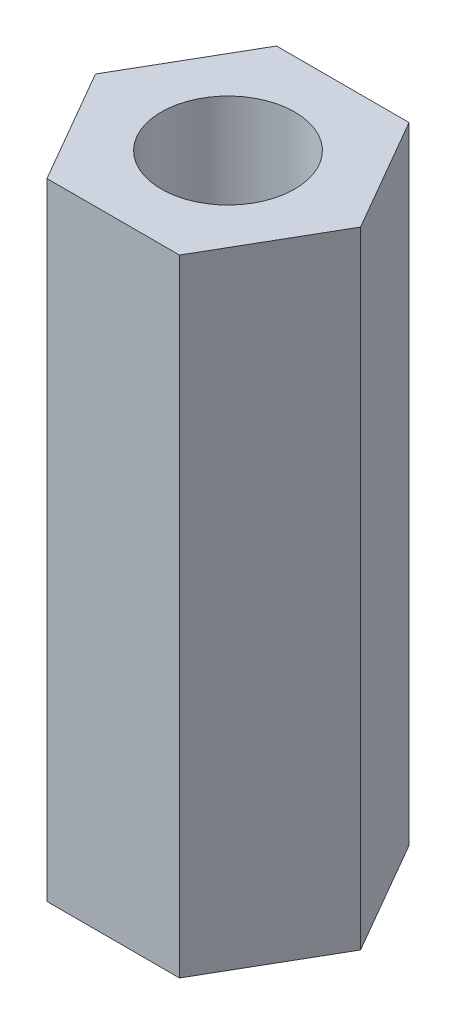
ISO-10303-21;
HEADER;
FILE_DESCRIPTION(('STEP AP214'),'2;1');
FILE_NAME('part.step','',(''),(''),'','','');
FILE_SCHEMA(('AUTOMOTIVE_DESIGN { 1 0 10303 214 1 1 1 1 }'));
ENDSEC;
DATA;
#1=APPLICATION_CONTEXT('core data for automotive mechanical design processes');
#2=APPLICATION_PROTOCOL_DEFINITION('international standard','automotive_design',2000,#1);
#3=PRODUCT_CONTEXT('',#1,'mechanical');
#4=PRODUCT('Part','Part','',(#3));
#5=PRODUCT_RELATED_PRODUCT_CATEGORY('part','',(#4));
#6=PRODUCT_DEFINITION_FORMATION('','',#4);
#7=PRODUCT_DEFINITION_CONTEXT('part definition',#1,'design');
#8=PRODUCT_DEFINITION('design','',#6,#7);
#9=PRODUCT_DEFINITION_SHAPE('','',#8);
#10=(LENGTH_UNIT() NAMED_UNIT(*) SI_UNIT(.MILLI.,.METRE.));
#11=(NAMED_UNIT(*) PLANE_ANGLE_UNIT() SI_UNIT($,.RADIAN.));
#12=(NAMED_UNIT(*) SI_UNIT($,.STERADIAN.) SOLID_ANGLE_UNIT());
#13=UNCERTAINTY_MEASURE_WITH_UNIT(LENGTH_MEASURE(1.E-05),#10,'distance_accuracy_value','');
#14=(GEOMETRIC_REPRESENTATION_CONTEXT(3) GLOBAL_UNCERTAINTY_ASSIGNED_CONTEXT((#13)) GLOBAL_UNIT_ASSIGNED_CONTEXT((#10,
#11,#12)) REPRESENTATION_CONTEXT('',''));
#15=CARTESIAN_POINT('',(0.,0.,0.));
#16=DIRECTION('',(0.,0.,1.));
#17=DIRECTION('',(1.,0.,0.));
#18=AXIS2_PLACEMENT_3D('',#15,#16,#17);
#19=CARTESIAN_POINT('',(1.5877132402715,15.,2.74999999999998));
#20=DIRECTION('',(-0.866025403784441,0.,-0.499999999999995));
#21=DIRECTION('',(-0.499999999999995,0.,0.866025403784441));
#22=AXIS2_PLACEMENT_3D('',#19,#20,#21);
#23=PLANE('',#22);
#24=DIRECTION('',(0.499999999999995,0.,-0.866025403784441));
#25=VECTOR('',#24,1.);
#26=CARTESIAN_POINT('',(1.5877132402715,0.,2.74999999999998));
#27=LINE('',#26,#25);
#28=CARTESIAN_POINT('',(1.5877132402715,0.,2.74999999999998));
#29=VERTEX_POINT('',#28);
#30=CARTESIAN_POINT('',(3.17542648054294,0.,0.));
#31=VERTEX_POINT('',#30);
#32=EDGE_CURVE('E128',#29,#31,#27,.T.);
#33=ORIENTED_EDGE('',*,*,#32,.T.);
#34=DIRECTION('',(0.,-1.,0.));
#35=VECTOR('',#34,1.);
#36=CARTESIAN_POINT('',(3.17542648054294,15.,0.));
#37=LINE('',#36,#35);
#38=CARTESIAN_POINT('',(3.17542648054294,15.,0.));
#39=VERTEX_POINT('',#38);
#40=EDGE_CURVE('E11',#39,#31,#37,.T.);
#41=ORIENTED_EDGE('',*,*,#40,.F.);
#42=DIRECTION('',(0.499999999999995,0.,-0.866025403784441));
#43=VECTOR('',#42,1.);
#44=CARTESIAN_POINT('',(1.5877132402715,15.,2.74999999999998));
#45=LINE('',#44,#43);
#46=CARTESIAN_POINT('',(1.5877132402715,15.,2.74999999999998));
#47=VERTEX_POINT('',#46);
#48=EDGE_CURVE('E145',#47,#39,#45,.T.);
#49=ORIENTED_EDGE('',*,*,#48,.F.);
#50=DIRECTION('',(0.,-1.,0.));
#51=VECTOR('',#50,1.);
#52=CARTESIAN_POINT('',(1.5877132402715,15.,2.74999999999998));
#53=LINE('',#52,#51);
#54=EDGE_CURVE('E124',#47,#29,#53,.T.);
#55=ORIENTED_EDGE('',*,*,#54,.T.);
#56=EDGE_LOOP('',(#33,#41,#49,#55));
#57=FACE_BOUND('',#56,.T.);
#58=ADVANCED_FACE('F39',(#57),#23,.F.);
#59=CARTESIAN_POINT('',(3.17542648054294,15.,0.));
#60=DIRECTION('',(-0.866025403784438,0.,0.500000000000001));
#61=DIRECTION('',(0.500000000000001,0.,0.866025403784438));
#62=AXIS2_PLACEMENT_3D('',#59,#60,#61);
#63=PLANE('',#62);
#64=DIRECTION('',(-0.500000000000001,0.,-0.866025403784438));
#65=VECTOR('',#64,1.);
#66=CARTESIAN_POINT('',(3.17542648054294,0.,0.));
#67=LINE('',#66,#65);
#68=CARTESIAN_POINT('',(1.58771324027147,0.,-2.75000000000001));
#69=VERTEX_POINT('',#68);
#70=EDGE_CURVE('E132',#31,#69,#67,.T.);
#71=ORIENTED_EDGE('',*,*,#70,.T.);
#72=DIRECTION('',(0.,-1.,0.));
#73=VECTOR('',#72,1.);
#74=CARTESIAN_POINT('',(1.58771324027147,15.,-2.75000000000001));
#75=LINE('',#74,#73);
#76=CARTESIAN_POINT('',(1.58771324027147,15.,-2.75000000000001));
#77=VERTEX_POINT('',#76);
#78=EDGE_CURVE('E48',#77,#69,#75,.T.);
#79=ORIENTED_EDGE('',*,*,#78,.F.);
#80=DIRECTION('',(-0.500000000000001,0.,-0.866025403784438));
#81=VECTOR('',#80,1.);
#82=CARTESIAN_POINT('',(3.17542648054294,15.,0.));
#83=LINE('',#82,#81);
#84=EDGE_CURVE('E93',#39,#77,#83,.T.);
#85=ORIENTED_EDGE('',*,*,#84,.F.);
#86=ORIENTED_EDGE('',*,*,#40,.T.);
#87=EDGE_LOOP('',(#71,#79,#85,#86));
#88=FACE_BOUND('',#87,.T.);
#89=ADVANCED_FACE('F174',(#88),#63,.F.);
#90=CARTESIAN_POINT('',(1.58771324027147,15.,-2.75000000000001));
#91=DIRECTION('',(0.,0.,1.));
#92=DIRECTION('',(1.,0.,0.));
#93=AXIS2_PLACEMENT_3D('',#90,#91,#92);
#94=PLANE('',#93);
#95=DIRECTION('',(-1.,0.,0.));
#96=VECTOR('',#95,1.);
#97=CARTESIAN_POINT('',(1.58771324027147,0.,-2.75000000000001));
#98=LINE('',#97,#96);
#99=CARTESIAN_POINT('',(-1.58771324027148,0.,-2.74999999999999));
#100=VERTEX_POINT('',#99);
#101=EDGE_CURVE('E136',#69,#100,#98,.T.);
#102=ORIENTED_EDGE('',*,*,#101,.T.);
#103=DIRECTION('',(0.,-1.,0.));
#104=VECTOR('',#103,1.);
#105=CARTESIAN_POINT('',(-1.58771324027148,15.,-2.74999999999999));
#106=LINE('',#105,#104);
#107=CARTESIAN_POINT('',(-1.58771324027148,15.,-2.74999999999999));
#108=VERTEX_POINT('',#107);
#109=EDGE_CURVE('E117',#108,#100,#106,.T.);
#110=ORIENTED_EDGE('',*,*,#109,.F.);
#111=DIRECTION('',(-1.,0.,0.));
#112=VECTOR('',#111,1.);
#113=CARTESIAN_POINT('',(1.58771324027147,15.,-2.75000000000001));
#114=LINE('',#113,#112);
#115=EDGE_CURVE('E106',#77,#108,#114,.T.);
#116=ORIENTED_EDGE('',*,*,#115,.F.);
#117=ORIENTED_EDGE('',*,*,#78,.T.);
#118=EDGE_LOOP('',(#102,#110,#116,#117));
#119=FACE_BOUND('',#118,.T.);
#120=ADVANCED_FACE('F155',(#119),#94,.F.);
#121=CARTESIAN_POINT('',(-1.58771324027148,15.,-2.74999999999999));
#122=DIRECTION('',(0.866025403784441,0.,0.499999999999995));
#123=DIRECTION('',(0.499999999999995,0.,-0.866025403784441));
#124=AXIS2_PLACEMENT_3D('',#121,#122,#123);
#125=PLANE('',#124);
#126=DIRECTION('',(-0.499999999999995,0.,0.866025403784441));
#127=VECTOR('',#126,1.);
#128=CARTESIAN_POINT('',(-1.58771324027148,0.,-2.74999999999999));
#129=LINE('',#128,#127);
#130=CARTESIAN_POINT('',(-3.17542648054294,0.,0.));
#131=VERTEX_POINT('',#130);
#132=EDGE_CURVE('E115',#100,#131,#129,.T.);
#133=ORIENTED_EDGE('',*,*,#132,.T.);
#134=DIRECTION('',(0.,-1.,0.));
#135=VECTOR('',#134,1.);
#136=CARTESIAN_POINT('',(-3.17542648054294,15.,0.));
#137=LINE('',#136,#135);
#138=CARTESIAN_POINT('',(-3.17542648054294,15.,0.));
#139=VERTEX_POINT('',#138);
#140=EDGE_CURVE('E112',#139,#131,#137,.T.);
#141=ORIENTED_EDGE('',*,*,#140,.F.);
#142=DIRECTION('',(-0.499999999999995,0.,0.866025403784441));
#143=VECTOR('',#142,1.);
#144=CARTESIAN_POINT('',(-1.58771324027148,15.,-2.74999999999999));
#145=LINE('',#144,#143);
#146=EDGE_CURVE('E100',#108,#139,#145,.T.);
#147=ORIENTED_EDGE('',*,*,#146,.F.);
#148=ORIENTED_EDGE('',*,*,#109,.T.);
#149=EDGE_LOOP('',(#133,#141,#147,#148));
#150=FACE_BOUND('',#149,.T.);
#151=ADVANCED_FACE('F113',(#150),#125,.F.);
#152=CARTESIAN_POINT('',(-3.17542648054294,15.,0.));
#153=DIRECTION('',(0.866025403784434,0.,-0.500000000000007));
#154=DIRECTION('',(-0.500000000000007,0.,-0.866025403784435));
#155=AXIS2_PLACEMENT_3D('',#152,#153,#154);
#156=PLANE('',#155);
#157=DIRECTION('',(0.500000000000007,0.,0.866025403784435));
#158=VECTOR('',#157,1.);
#159=CARTESIAN_POINT('',(-3.17542648054294,0.,0.));
#160=LINE('',#159,#158);
#161=CARTESIAN_POINT('',(-1.58771324027145,0.,2.75000000000002));
#162=VERTEX_POINT('',#161);
#163=EDGE_CURVE('E79',#131,#162,#160,.T.);
#164=ORIENTED_EDGE('',*,*,#163,.T.);
#165=DIRECTION('',(0.,-1.,0.));
#166=VECTOR('',#165,1.);
#167=CARTESIAN_POINT('',(-1.58771324027145,15.,2.75000000000002));
#168=LINE('',#167,#166);
#169=CARTESIAN_POINT('',(-1.58771324027145,15.,2.75000000000002));
#170=VERTEX_POINT('',#169);
#171=EDGE_CURVE('E118',#170,#162,#168,.T.);
#172=ORIENTED_EDGE('',*,*,#171,.F.);
#173=DIRECTION('',(0.500000000000007,0.,0.866025403784435));
#174=VECTOR('',#173,1.);
#175=CARTESIAN_POINT('',(-3.17542648054294,15.,0.));
#176=LINE('',#175,#174);
#177=EDGE_CURVE('E104',#139,#170,#176,.T.);
#178=ORIENTED_EDGE('',*,*,#177,.F.);
#179=ORIENTED_EDGE('',*,*,#140,.T.);
#180=EDGE_LOOP('',(#164,#172,#178,#179));
#181=FACE_BOUND('',#180,.T.);
#182=ADVANCED_FACE('F120',(#181),#156,.F.);
#183=CARTESIAN_POINT('',(-1.58771324027145,15.,2.75000000000002));
#184=DIRECTION('',(0.,0.,-1.));
#185=DIRECTION('',(-1.,0.,0.));
#186=AXIS2_PLACEMENT_3D('',#183,#184,#185);
#187=PLANE('',#186);
#188=DIRECTION('',(1.,0.,0.));
#189=VECTOR('',#188,1.);
#190=CARTESIAN_POINT('',(-1.58771324027145,0.,2.75000000000002));
#191=LINE('',#190,#189);
#192=EDGE_CURVE('E85',#162,#29,#191,.T.);
#193=ORIENTED_EDGE('',*,*,#192,.T.);
#194=ORIENTED_EDGE('',*,*,#54,.F.);
#195=DIRECTION('',(1.,0.,0.));
#196=VECTOR('',#195,1.);
#197=CARTESIAN_POINT('',(-1.58771324027145,15.,2.75000000000002));
#198=LINE('',#197,#196);
#199=EDGE_CURVE('E56',#170,#47,#198,.T.);
#200=ORIENTED_EDGE('',*,*,#199,.F.);
#201=ORIENTED_EDGE('',*,*,#171,.T.);
#202=EDGE_LOOP('',(#193,#194,#200,#201));
#203=FACE_BOUND('',#202,.T.);
#204=ADVANCED_FACE('F162',(#203),#187,.F.);
#205=CARTESIAN_POINT('',(0.,15.,0.));
#206=DIRECTION('',(0.,1.,0.));
#207=DIRECTION('',(0.,0.,1.));
#208=AXIS2_PLACEMENT_3D('',#205,#206,#207);
#209=PLANE('',#208);
#210=CARTESIAN_POINT('',(0.,15.,0.));
#211=DIRECTION('',(0.,-1.,0.));
#212=DIRECTION('',(0.,0.,-1.));
#213=AXIS2_PLACEMENT_3D('',#210,#211,#212);
#214=CIRCLE('',#213,1.6);
#215=CARTESIAN_POINT('',(0.,15.,-1.6));
#216=VERTEX_POINT('',#215);
#217=EDGE_CURVE('E133',#216,#216,#214,.T.);
#218=ORIENTED_EDGE('',*,*,#217,.T.);
#219=EDGE_LOOP('',(#218));
#220=FACE_BOUND('',#219,.T.);
#221=ORIENTED_EDGE('',*,*,#48,.T.);
#222=ORIENTED_EDGE('',*,*,#84,.T.);
#223=ORIENTED_EDGE('',*,*,#115,.T.);
#224=ORIENTED_EDGE('',*,*,#146,.T.);
#225=ORIENTED_EDGE('',*,*,#177,.T.);
#226=ORIENTED_EDGE('',*,*,#199,.T.);
#227=EDGE_LOOP('',(#221,#222,#223,#224,#225,#226));
#228=FACE_BOUND('',#227,.T.);
#229=ADVANCED_FACE('F102',(#220,#228),#209,.T.);
#230=CARTESIAN_POINT('',(0.,0.,0.));
#231=DIRECTION('',(0.,1.,0.));
#232=DIRECTION('',(0.,0.,1.));
#233=AXIS2_PLACEMENT_3D('',#230,#231,#232);
#234=PLANE('',#233);
#235=CARTESIAN_POINT('',(0.,0.,0.));
#236=DIRECTION('',(0.,-1.,0.));
#237=DIRECTION('',(0.,0.,-1.));
#238=AXIS2_PLACEMENT_3D('',#235,#236,#237);
#239=CIRCLE('',#238,1.6);
#240=CARTESIAN_POINT('',(0.,0.,-1.6));
#241=VERTEX_POINT('',#240);
#242=EDGE_CURVE('E229',#241,#241,#239,.T.);
#243=ORIENTED_EDGE('',*,*,#242,.F.);
#244=EDGE_LOOP('',(#243));
#245=FACE_BOUND('',#244,.T.);
#246=ORIENTED_EDGE('',*,*,#32,.F.);
#247=ORIENTED_EDGE('',*,*,#192,.F.);
#248=ORIENTED_EDGE('',*,*,#163,.F.);
#249=ORIENTED_EDGE('',*,*,#132,.F.);
#250=ORIENTED_EDGE('',*,*,#101,.F.);
#251=ORIENTED_EDGE('',*,*,#70,.F.);
#252=EDGE_LOOP('',(#246,#247,#248,#249,#250,#251));
#253=FACE_BOUND('',#252,.T.);
#254=ADVANCED_FACE('F158',(#245,#253),#234,.F.);
#255=CARTESIAN_POINT('',(0.,15.,0.));
#256=DIRECTION('',(0.,-1.,0.));
#257=DIRECTION('',(0.,0.,-1.));
#258=AXIS2_PLACEMENT_3D('',#255,#256,#257);
#259=CYLINDRICAL_SURFACE('',#258,1.6);
#260=ORIENTED_EDGE('',*,*,#217,.F.);
#261=EDGE_LOOP('',(#260));
#262=FACE_BOUND('',#261,.T.);
#263=ORIENTED_EDGE('',*,*,#242,.T.);
#264=EDGE_LOOP('',(#263));
#265=FACE_BOUND('',#264,.T.);
#266=ADVANCED_FACE('F211',(#262,#265),#259,.F.);
#267=CLOSED_SHELL('',(#58,#89,#120,#151,#182,#204,#229,#254,#266));
#268=MANIFOLD_SOLID_BREP('B2',#267);
#269=ADVANCED_BREP_SHAPE_REPRESENTATION('',(#18,#268),#14);
#270=SHAPE_DEFINITION_REPRESENTATION(#9,#269);
ENDSEC;
END-ISO-10303-21;
